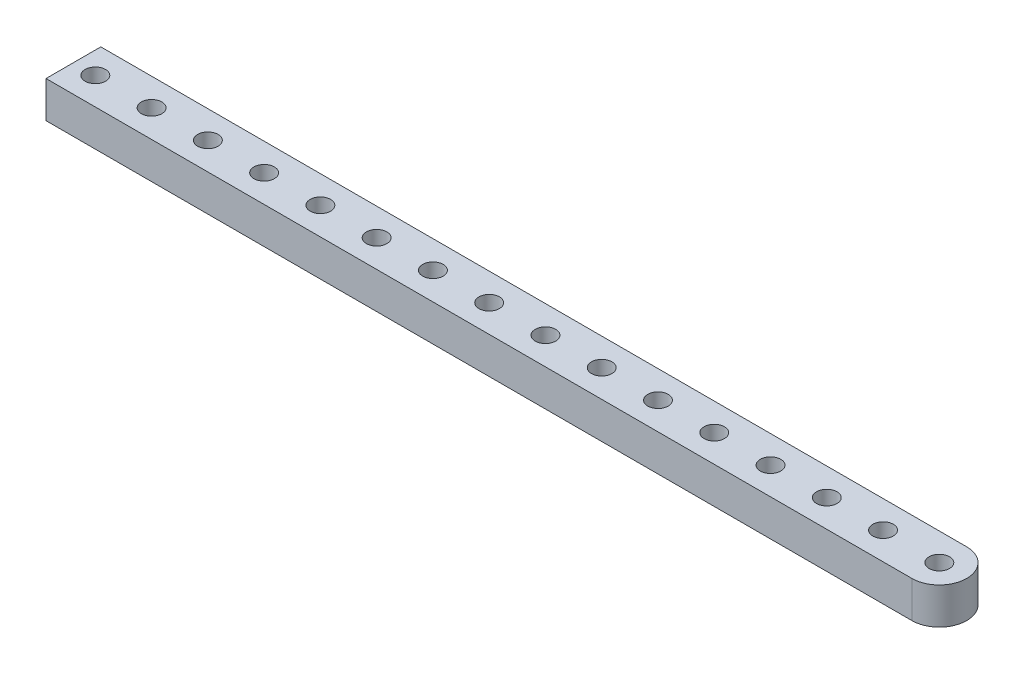
ISO-10303-21;
HEADER;
FILE_DESCRIPTION(('STEP AP214'),'2;1');
FILE_NAME('part.step','',(''),(''),'','','');
FILE_SCHEMA(('AUTOMOTIVE_DESIGN { 1 0 10303 214 1 1 1 1 }'));
ENDSEC;
DATA;
#1=APPLICATION_CONTEXT('core data for automotive mechanical design processes');
#2=APPLICATION_PROTOCOL_DEFINITION('international standard','automotive_design',2000,#1);
#3=PRODUCT_CONTEXT('',#1,'mechanical');
#4=PRODUCT('Part','Part','',(#3));
#5=PRODUCT_RELATED_PRODUCT_CATEGORY('part','',(#4));
#6=PRODUCT_DEFINITION_FORMATION('','',#4);
#7=PRODUCT_DEFINITION_CONTEXT('part definition',#1,'design');
#8=PRODUCT_DEFINITION('design','',#6,#7);
#9=PRODUCT_DEFINITION_SHAPE('','',#8);
#10=(LENGTH_UNIT() NAMED_UNIT(*) SI_UNIT(.MILLI.,.METRE.));
#11=(NAMED_UNIT(*) PLANE_ANGLE_UNIT() SI_UNIT($,.RADIAN.));
#12=(NAMED_UNIT(*) SI_UNIT($,.STERADIAN.) SOLID_ANGLE_UNIT());
#13=UNCERTAINTY_MEASURE_WITH_UNIT(LENGTH_MEASURE(1.E-05),#10,'distance_accuracy_value','');
#14=(GEOMETRIC_REPRESENTATION_CONTEXT(3) GLOBAL_UNCERTAINTY_ASSIGNED_CONTEXT((#13)) GLOBAL_UNIT_ASSIGNED_CONTEXT((#10,
#11,#12)) REPRESENTATION_CONTEXT('',''));
#15=CARTESIAN_POINT('',(0.,0.,0.));
#16=DIRECTION('',(0.,0.,1.));
#17=DIRECTION('',(1.,0.,0.));
#18=AXIS2_PLACEMENT_3D('',#15,#16,#17);
#19=CARTESIAN_POINT('',(78.232,0.,0.));
#20=DIRECTION('',(0.,1.,0.));
#21=DIRECTION('',(0.,0.,1.));
#22=AXIS2_PLACEMENT_3D('',#19,#20,#21);
#23=CYLINDRICAL_SURFACE('',#22,4.76250000000002);
#24=CARTESIAN_POINT('',(78.232,6.35,0.));
#25=DIRECTION('',(0.,1.,0.));
#26=DIRECTION('',(0.,0.,1.));
#27=AXIS2_PLACEMENT_3D('',#24,#25,#26);
#28=CIRCLE('',#27,4.76250000000002);
#29=CARTESIAN_POINT('',(78.232,6.35,4.76250000000002));
#30=VERTEX_POINT('',#29);
#31=CARTESIAN_POINT('',(78.232,6.35,-4.76250000000002));
#32=VERTEX_POINT('',#31);
#33=EDGE_CURVE('E76',#30,#32,#28,.T.);
#34=ORIENTED_EDGE('',*,*,#33,.F.);
#35=DIRECTION('',(0.,1.,0.));
#36=VECTOR('',#35,1.);
#37=CARTESIAN_POINT('',(78.232,0.,4.76250000000002));
#38=LINE('',#37,#36);
#39=CARTESIAN_POINT('',(78.232,0.,4.76250000000002));
#40=VERTEX_POINT('',#39);
#41=EDGE_CURVE('E11',#40,#30,#38,.T.);
#42=ORIENTED_EDGE('',*,*,#41,.F.);
#43=CARTESIAN_POINT('',(78.232,0.,0.));
#44=DIRECTION('',(0.,1.,0.));
#45=DIRECTION('',(0.,0.,1.));
#46=AXIS2_PLACEMENT_3D('',#43,#44,#45);
#47=CIRCLE('',#46,4.76250000000002);
#48=CARTESIAN_POINT('',(78.232,0.,-4.76250000000002));
#49=VERTEX_POINT('',#48);
#50=EDGE_CURVE('E78',#40,#49,#47,.T.);
#51=ORIENTED_EDGE('',*,*,#50,.T.);
#52=DIRECTION('',(0.,1.,0.));
#53=VECTOR('',#52,1.);
#54=CARTESIAN_POINT('',(78.232,0.,-4.76250000000002));
#55=LINE('',#54,#53);
#56=EDGE_CURVE('E39',#49,#32,#55,.T.);
#57=ORIENTED_EDGE('',*,*,#56,.T.);
#58=EDGE_LOOP('',(#34,#42,#51,#57));
#59=FACE_BOUND('',#58,.T.);
#60=ADVANCED_FACE('F36',(#59),#23,.T.);
#61=CARTESIAN_POINT('',(-78.232,0.,4.76250000000002));
#62=DIRECTION('',(0.,0.,1.));
#63=DIRECTION('',(1.,0.,0.));
#64=AXIS2_PLACEMENT_3D('',#61,#62,#63);
#65=PLANE('',#64);
#66=DIRECTION('',(0.,1.,0.));
#67=VECTOR('',#66,1.);
#68=CARTESIAN_POINT('',(-72.263,0.,4.76250000000002));
#69=LINE('',#68,#67);
#70=CARTESIAN_POINT('',(-72.263,0.,4.76250000000002));
#71=VERTEX_POINT('',#70);
#72=CARTESIAN_POINT('',(-72.263,6.35,4.76250000000002));
#73=VERTEX_POINT('',#72);
#74=EDGE_CURVE('E50',#71,#73,#69,.T.);
#75=ORIENTED_EDGE('',*,*,#74,.F.);
#76=DIRECTION('',(1.,0.,0.));
#77=VECTOR('',#76,1.);
#78=CARTESIAN_POINT('',(-78.232,0.,4.76250000000002));
#79=LINE('',#78,#77);
#80=EDGE_CURVE('E57',#71,#40,#79,.T.);
#81=ORIENTED_EDGE('',*,*,#80,.T.);
#82=ORIENTED_EDGE('',*,*,#41,.T.);
#83=DIRECTION('',(1.,0.,0.));
#84=VECTOR('',#83,1.);
#85=CARTESIAN_POINT('',(-78.232,6.35,4.76250000000002));
#86=LINE('',#85,#84);
#87=EDGE_CURVE('E71',#73,#30,#86,.T.);
#88=ORIENTED_EDGE('',*,*,#87,.F.);
#89=EDGE_LOOP('',(#75,#81,#82,#88));
#90=FACE_BOUND('',#89,.T.);
#91=ADVANCED_FACE('F81',(#90),#65,.T.);
#92=CARTESIAN_POINT('',(78.232,0.,-4.76250000000002));
#93=DIRECTION('',(0.,0.,-1.));
#94=DIRECTION('',(-1.,0.,0.));
#95=AXIS2_PLACEMENT_3D('',#92,#93,#94);
#96=PLANE('',#95);
#97=DIRECTION('',(0.,-1.,0.));
#98=VECTOR('',#97,1.);
#99=CARTESIAN_POINT('',(-72.263,0.,-4.76250000000001));
#100=LINE('',#99,#98);
#101=CARTESIAN_POINT('',(-72.263,6.35,-4.76250000000002));
#102=VERTEX_POINT('',#101);
#103=CARTESIAN_POINT('',(-72.263,0.,-4.76250000000002));
#104=VERTEX_POINT('',#103);
#105=EDGE_CURVE('E188',#102,#104,#100,.T.);
#106=ORIENTED_EDGE('',*,*,#105,.F.);
#107=DIRECTION('',(-1.,0.,0.));
#108=VECTOR('',#107,1.);
#109=CARTESIAN_POINT('',(78.232,6.35,-4.76250000000002));
#110=LINE('',#109,#108);
#111=EDGE_CURVE('E79',#32,#102,#110,.T.);
#112=ORIENTED_EDGE('',*,*,#111,.F.);
#113=ORIENTED_EDGE('',*,*,#56,.F.);
#114=DIRECTION('',(-1.,0.,0.));
#115=VECTOR('',#114,1.);
#116=CARTESIAN_POINT('',(78.232,0.,-4.76250000000002));
#117=LINE('',#116,#115);
#118=EDGE_CURVE('E94',#49,#104,#117,.T.);
#119=ORIENTED_EDGE('',*,*,#118,.T.);
#120=EDGE_LOOP('',(#106,#112,#113,#119));
#121=FACE_BOUND('',#120,.T.);
#122=ADVANCED_FACE('F204',(#121),#96,.T.);
#123=CARTESIAN_POINT('',(78.232,0.,0.));
#124=DIRECTION('',(0.,1.,0.));
#125=DIRECTION('',(0.,0.,1.));
#126=AXIS2_PLACEMENT_3D('',#123,#124,#125);
#127=PLANE('',#126);
#128=CARTESIAN_POINT('',(-68.453,0.,0.));
#129=DIRECTION('',(0.,1.,0.));
#130=DIRECTION('',(0.,0.,-1.));
#131=AXIS2_PLACEMENT_3D('',#128,#129,#130);
#132=CIRCLE('',#131,1.77799999999999);
#133=CARTESIAN_POINT('',(-68.453,0.,-1.77799999999999));
#134=VERTEX_POINT('',#133);
#135=EDGE_CURVE('E182',#134,#134,#132,.T.);
#136=ORIENTED_EDGE('',*,*,#135,.T.);
#137=EDGE_LOOP('',(#136));
#138=FACE_BOUND('',#137,.T.);
#139=CARTESIAN_POINT('',(-58.674,0.,0.));
#140=DIRECTION('',(0.,1.,0.));
#141=DIRECTION('',(0.,0.,-1.));
#142=AXIS2_PLACEMENT_3D('',#139,#140,#141);
#143=CIRCLE('',#142,1.77799999999999);
#144=CARTESIAN_POINT('',(-58.674,0.,-1.77799999999999));
#145=VERTEX_POINT('',#144);
#146=EDGE_CURVE('E176',#145,#145,#143,.T.);
#147=ORIENTED_EDGE('',*,*,#146,.T.);
#148=EDGE_LOOP('',(#147));
#149=FACE_BOUND('',#148,.T.);
#150=CARTESIAN_POINT('',(-48.895,0.,0.));
#151=DIRECTION('',(0.,1.,0.));
#152=DIRECTION('',(0.,0.,-1.));
#153=AXIS2_PLACEMENT_3D('',#150,#151,#152);
#154=CIRCLE('',#153,1.77799999999999);
#155=CARTESIAN_POINT('',(-48.895,0.,-1.77799999999999));
#156=VERTEX_POINT('',#155);
#157=EDGE_CURVE('E170',#156,#156,#154,.T.);
#158=ORIENTED_EDGE('',*,*,#157,.T.);
#159=EDGE_LOOP('',(#158));
#160=FACE_BOUND('',#159,.T.);
#161=CARTESIAN_POINT('',(-39.116,0.,0.));
#162=DIRECTION('',(0.,1.,0.));
#163=DIRECTION('',(0.,0.,-1.));
#164=AXIS2_PLACEMENT_3D('',#161,#162,#163);
#165=CIRCLE('',#164,1.77799999999999);
#166=CARTESIAN_POINT('',(-39.116,0.,-1.77799999999999));
#167=VERTEX_POINT('',#166);
#168=EDGE_CURVE('E164',#167,#167,#165,.T.);
#169=ORIENTED_EDGE('',*,*,#168,.T.);
#170=EDGE_LOOP('',(#169));
#171=FACE_BOUND('',#170,.T.);
#172=CARTESIAN_POINT('',(-29.337,0.,0.));
#173=DIRECTION('',(0.,1.,0.));
#174=DIRECTION('',(0.,0.,-1.));
#175=AXIS2_PLACEMENT_3D('',#172,#173,#174);
#176=CIRCLE('',#175,1.77799999999999);
#177=CARTESIAN_POINT('',(-29.337,0.,-1.77799999999998));
#178=VERTEX_POINT('',#177);
#179=EDGE_CURVE('E158',#178,#178,#176,.T.);
#180=ORIENTED_EDGE('',*,*,#179,.T.);
#181=EDGE_LOOP('',(#180));
#182=FACE_BOUND('',#181,.T.);
#183=CARTESIAN_POINT('',(-19.558,0.,0.));
#184=DIRECTION('',(0.,1.,0.));
#185=DIRECTION('',(0.,0.,-1.));
#186=AXIS2_PLACEMENT_3D('',#183,#184,#185);
#187=CIRCLE('',#186,1.77799999999999);
#188=CARTESIAN_POINT('',(-19.558,0.,-1.77799999999998));
#189=VERTEX_POINT('',#188);
#190=EDGE_CURVE('E152',#189,#189,#187,.T.);
#191=ORIENTED_EDGE('',*,*,#190,.T.);
#192=EDGE_LOOP('',(#191));
#193=FACE_BOUND('',#192,.T.);
#194=CARTESIAN_POINT('',(-9.77900000000001,0.,0.));
#195=DIRECTION('',(0.,1.,0.));
#196=DIRECTION('',(0.,0.,-1.));
#197=AXIS2_PLACEMENT_3D('',#194,#195,#196);
#198=CIRCLE('',#197,1.77799999999999);
#199=CARTESIAN_POINT('',(-9.77900000000001,0.,-1.77799999999998));
#200=VERTEX_POINT('',#199);
#201=EDGE_CURVE('E146',#200,#200,#198,.T.);
#202=ORIENTED_EDGE('',*,*,#201,.T.);
#203=EDGE_LOOP('',(#202));
#204=FACE_BOUND('',#203,.T.);
#205=CARTESIAN_POINT('',(0.,0.,0.));
#206=DIRECTION('',(0.,1.,0.));
#207=DIRECTION('',(0.,0.,-1.));
#208=AXIS2_PLACEMENT_3D('',#205,#206,#207);
#209=CIRCLE('',#208,1.77799999999999);
#210=CARTESIAN_POINT('',(0.,0.,-1.77799999999998));
#211=VERTEX_POINT('',#210);
#212=EDGE_CURVE('E140',#211,#211,#209,.T.);
#213=ORIENTED_EDGE('',*,*,#212,.T.);
#214=EDGE_LOOP('',(#213));
#215=FACE_BOUND('',#214,.T.);
#216=CARTESIAN_POINT('',(9.77899999999998,0.,0.));
#217=DIRECTION('',(0.,1.,0.));
#218=DIRECTION('',(0.,0.,-1.));
#219=AXIS2_PLACEMENT_3D('',#216,#217,#218);
#220=CIRCLE('',#219,1.77799999999999);
#221=CARTESIAN_POINT('',(9.77899999999998,0.,-1.77799999999998));
#222=VERTEX_POINT('',#221);
#223=EDGE_CURVE('E134',#222,#222,#220,.T.);
#224=ORIENTED_EDGE('',*,*,#223,.T.);
#225=EDGE_LOOP('',(#224));
#226=FACE_BOUND('',#225,.T.);
#227=CARTESIAN_POINT('',(19.558,0.,0.));
#228=DIRECTION('',(0.,1.,0.));
#229=DIRECTION('',(0.,0.,-1.));
#230=AXIS2_PLACEMENT_3D('',#227,#228,#229);
#231=CIRCLE('',#230,1.77799999999999);
#232=CARTESIAN_POINT('',(19.558,0.,-1.77799999999998));
#233=VERTEX_POINT('',#232);
#234=EDGE_CURVE('E128',#233,#233,#231,.T.);
#235=ORIENTED_EDGE('',*,*,#234,.T.);
#236=EDGE_LOOP('',(#235));
#237=FACE_BOUND('',#236,.T.);
#238=CARTESIAN_POINT('',(29.337,0.,0.));
#239=DIRECTION('',(0.,1.,0.));
#240=DIRECTION('',(0.,0.,-1.));
#241=AXIS2_PLACEMENT_3D('',#238,#239,#240);
#242=CIRCLE('',#241,1.77799999999999);
#243=CARTESIAN_POINT('',(29.337,0.,-1.77799999999998));
#244=VERTEX_POINT('',#243);
#245=EDGE_CURVE('E122',#244,#244,#242,.T.);
#246=ORIENTED_EDGE('',*,*,#245,.T.);
#247=EDGE_LOOP('',(#246));
#248=FACE_BOUND('',#247,.T.);
#249=CARTESIAN_POINT('',(39.116,0.,0.));
#250=DIRECTION('',(0.,1.,0.));
#251=DIRECTION('',(0.,0.,-1.));
#252=AXIS2_PLACEMENT_3D('',#249,#250,#251);
#253=CIRCLE('',#252,1.77799999999999);
#254=CARTESIAN_POINT('',(39.116,0.,-1.77799999999998));
#255=VERTEX_POINT('',#254);
#256=EDGE_CURVE('E116',#255,#255,#253,.T.);
#257=ORIENTED_EDGE('',*,*,#256,.T.);
#258=EDGE_LOOP('',(#257));
#259=FACE_BOUND('',#258,.T.);
#260=CARTESIAN_POINT('',(48.895,0.,0.));
#261=DIRECTION('',(0.,1.,0.));
#262=DIRECTION('',(0.,0.,-1.));
#263=AXIS2_PLACEMENT_3D('',#260,#261,#262);
#264=CIRCLE('',#263,1.77799999999999);
#265=CARTESIAN_POINT('',(48.895,0.,-1.77799999999998));
#266=VERTEX_POINT('',#265);
#267=EDGE_CURVE('E110',#266,#266,#264,.T.);
#268=ORIENTED_EDGE('',*,*,#267,.T.);
#269=EDGE_LOOP('',(#268));
#270=FACE_BOUND('',#269,.T.);
#271=CARTESIAN_POINT('',(58.674,0.,0.));
#272=DIRECTION('',(0.,1.,0.));
#273=DIRECTION('',(0.,0.,-1.));
#274=AXIS2_PLACEMENT_3D('',#271,#272,#273);
#275=CIRCLE('',#274,1.77799999999999);
#276=CARTESIAN_POINT('',(58.674,0.,-1.77799999999998));
#277=VERTEX_POINT('',#276);
#278=EDGE_CURVE('E104',#277,#277,#275,.T.);
#279=ORIENTED_EDGE('',*,*,#278,.T.);
#280=EDGE_LOOP('',(#279));
#281=FACE_BOUND('',#280,.T.);
#282=CARTESIAN_POINT('',(68.453,0.,0.));
#283=DIRECTION('',(0.,1.,0.));
#284=DIRECTION('',(0.,0.,-1.));
#285=AXIS2_PLACEMENT_3D('',#282,#283,#284);
#286=CIRCLE('',#285,1.77799999999999);
#287=CARTESIAN_POINT('',(68.453,0.,-1.77799999999997));
#288=VERTEX_POINT('',#287);
#289=EDGE_CURVE('E99',#288,#288,#286,.T.);
#290=ORIENTED_EDGE('',*,*,#289,.T.);
#291=EDGE_LOOP('',(#290));
#292=FACE_BOUND('',#291,.T.);
#293=CARTESIAN_POINT('',(78.232,0.,0.));
#294=DIRECTION('',(0.,1.,0.));
#295=DIRECTION('',(0.,0.,-1.));
#296=AXIS2_PLACEMENT_3D('',#293,#294,#295);
#297=CIRCLE('',#296,1.77799999999999);
#298=CARTESIAN_POINT('',(78.232,0.,-1.77799999999997));
#299=VERTEX_POINT('',#298);
#300=EDGE_CURVE('E86',#299,#299,#297,.T.);
#301=ORIENTED_EDGE('',*,*,#300,.T.);
#302=EDGE_LOOP('',(#301));
#303=FACE_BOUND('',#302,.T.);
#304=ORIENTED_EDGE('',*,*,#80,.F.);
#305=DIRECTION('',(0.,0.,-1.));
#306=VECTOR('',#305,1.);
#307=CARTESIAN_POINT('',(-72.263,0.,-5.07999999999998));
#308=LINE('',#307,#306);
#309=EDGE_CURVE('E194',#71,#104,#308,.T.);
#310=ORIENTED_EDGE('',*,*,#309,.T.);
#311=ORIENTED_EDGE('',*,*,#118,.F.);
#312=ORIENTED_EDGE('',*,*,#50,.F.);
#313=EDGE_LOOP('',(#304,#310,#311,#312));
#314=FACE_BOUND('',#313,.T.);
#315=ADVANCED_FACE('F199',(#138,#149,#160,#171,#182,#193,#204,#215,#226,#237,#248,#259,#270,
#281,#292,#303,#314),#127,.F.);
#316=CARTESIAN_POINT('',(78.232,6.35,0.));
#317=DIRECTION('',(0.,1.,0.));
#318=DIRECTION('',(0.,0.,1.));
#319=AXIS2_PLACEMENT_3D('',#316,#317,#318);
#320=PLANE('',#319);
#321=DIRECTION('',(0.,0.,-1.));
#322=VECTOR('',#321,1.);
#323=CARTESIAN_POINT('',(-72.263,6.35,-5.07999999999998));
#324=LINE('',#323,#322);
#325=EDGE_CURVE('E77',#73,#102,#324,.T.);
#326=ORIENTED_EDGE('',*,*,#325,.F.);
#327=ORIENTED_EDGE('',*,*,#87,.T.);
#328=ORIENTED_EDGE('',*,*,#33,.T.);
#329=ORIENTED_EDGE('',*,*,#111,.T.);
#330=EDGE_LOOP('',(#326,#327,#328,#329));
#331=FACE_BOUND('',#330,.T.);
#332=CARTESIAN_POINT('',(-68.453,6.35,0.));
#333=DIRECTION('',(0.,1.,0.));
#334=DIRECTION('',(0.,0.,-1.));
#335=AXIS2_PLACEMENT_3D('',#332,#333,#334);
#336=CIRCLE('',#335,1.77799999999999);
#337=CARTESIAN_POINT('',(-68.453,6.35,-1.77799999999999));
#338=VERTEX_POINT('',#337);
#339=EDGE_CURVE('E185',#338,#338,#336,.T.);
#340=ORIENTED_EDGE('',*,*,#339,.F.);
#341=EDGE_LOOP('',(#340));
#342=FACE_BOUND('',#341,.T.);
#343=CARTESIAN_POINT('',(-58.674,6.35,0.));
#344=DIRECTION('',(0.,1.,0.));
#345=DIRECTION('',(0.,0.,-1.));
#346=AXIS2_PLACEMENT_3D('',#343,#344,#345);
#347=CIRCLE('',#346,1.77799999999999);
#348=CARTESIAN_POINT('',(-58.674,6.35,-1.77799999999999));
#349=VERTEX_POINT('',#348);
#350=EDGE_CURVE('E179',#349,#349,#347,.T.);
#351=ORIENTED_EDGE('',*,*,#350,.F.);
#352=EDGE_LOOP('',(#351));
#353=FACE_BOUND('',#352,.T.);
#354=CARTESIAN_POINT('',(-48.895,6.35,0.));
#355=DIRECTION('',(0.,1.,0.));
#356=DIRECTION('',(0.,0.,-1.));
#357=AXIS2_PLACEMENT_3D('',#354,#355,#356);
#358=CIRCLE('',#357,1.77799999999999);
#359=CARTESIAN_POINT('',(-48.895,6.35,-1.77799999999999));
#360=VERTEX_POINT('',#359);
#361=EDGE_CURVE('E173',#360,#360,#358,.T.);
#362=ORIENTED_EDGE('',*,*,#361,.F.);
#363=EDGE_LOOP('',(#362));
#364=FACE_BOUND('',#363,.T.);
#365=CARTESIAN_POINT('',(-39.116,6.35,0.));
#366=DIRECTION('',(0.,1.,0.));
#367=DIRECTION('',(0.,0.,-1.));
#368=AXIS2_PLACEMENT_3D('',#365,#366,#367);
#369=CIRCLE('',#368,1.77799999999999);
#370=CARTESIAN_POINT('',(-39.116,6.35,-1.77799999999999));
#371=VERTEX_POINT('',#370);
#372=EDGE_CURVE('E167',#371,#371,#369,.T.);
#373=ORIENTED_EDGE('',*,*,#372,.F.);
#374=EDGE_LOOP('',(#373));
#375=FACE_BOUND('',#374,.T.);
#376=CARTESIAN_POINT('',(-29.337,6.35,0.));
#377=DIRECTION('',(0.,1.,0.));
#378=DIRECTION('',(0.,0.,-1.));
#379=AXIS2_PLACEMENT_3D('',#376,#377,#378);
#380=CIRCLE('',#379,1.77799999999999);
#381=CARTESIAN_POINT('',(-29.337,6.35,-1.77799999999998));
#382=VERTEX_POINT('',#381);
#383=EDGE_CURVE('E161',#382,#382,#380,.T.);
#384=ORIENTED_EDGE('',*,*,#383,.F.);
#385=EDGE_LOOP('',(#384));
#386=FACE_BOUND('',#385,.T.);
#387=CARTESIAN_POINT('',(-19.558,6.35,0.));
#388=DIRECTION('',(0.,1.,0.));
#389=DIRECTION('',(0.,0.,-1.));
#390=AXIS2_PLACEMENT_3D('',#387,#388,#389);
#391=CIRCLE('',#390,1.77799999999999);
#392=CARTESIAN_POINT('',(-19.558,6.35,-1.77799999999998));
#393=VERTEX_POINT('',#392);
#394=EDGE_CURVE('E155',#393,#393,#391,.T.);
#395=ORIENTED_EDGE('',*,*,#394,.F.);
#396=EDGE_LOOP('',(#395));
#397=FACE_BOUND('',#396,.T.);
#398=CARTESIAN_POINT('',(-9.77900000000001,6.35,0.));
#399=DIRECTION('',(0.,1.,0.));
#400=DIRECTION('',(0.,0.,-1.));
#401=AXIS2_PLACEMENT_3D('',#398,#399,#400);
#402=CIRCLE('',#401,1.77799999999999);
#403=CARTESIAN_POINT('',(-9.77900000000001,6.35,-1.77799999999998));
#404=VERTEX_POINT('',#403);
#405=EDGE_CURVE('E149',#404,#404,#402,.T.);
#406=ORIENTED_EDGE('',*,*,#405,.F.);
#407=EDGE_LOOP('',(#406));
#408=FACE_BOUND('',#407,.T.);
#409=CARTESIAN_POINT('',(0.,6.35,0.));
#410=DIRECTION('',(0.,1.,0.));
#411=DIRECTION('',(0.,0.,-1.));
#412=AXIS2_PLACEMENT_3D('',#409,#410,#411);
#413=CIRCLE('',#412,1.77799999999999);
#414=CARTESIAN_POINT('',(0.,6.35,-1.77799999999998));
#415=VERTEX_POINT('',#414);
#416=EDGE_CURVE('E143',#415,#415,#413,.T.);
#417=ORIENTED_EDGE('',*,*,#416,.F.);
#418=EDGE_LOOP('',(#417));
#419=FACE_BOUND('',#418,.T.);
#420=CARTESIAN_POINT('',(9.77899999999998,6.35,0.));
#421=DIRECTION('',(0.,1.,0.));
#422=DIRECTION('',(0.,0.,-1.));
#423=AXIS2_PLACEMENT_3D('',#420,#421,#422);
#424=CIRCLE('',#423,1.77799999999999);
#425=CARTESIAN_POINT('',(9.77899999999998,6.35,-1.77799999999998));
#426=VERTEX_POINT('',#425);
#427=EDGE_CURVE('E137',#426,#426,#424,.T.);
#428=ORIENTED_EDGE('',*,*,#427,.F.);
#429=EDGE_LOOP('',(#428));
#430=FACE_BOUND('',#429,.T.);
#431=CARTESIAN_POINT('',(19.558,6.35,0.));
#432=DIRECTION('',(0.,1.,0.));
#433=DIRECTION('',(0.,0.,-1.));
#434=AXIS2_PLACEMENT_3D('',#431,#432,#433);
#435=CIRCLE('',#434,1.77799999999999);
#436=CARTESIAN_POINT('',(19.558,6.35,-1.77799999999998));
#437=VERTEX_POINT('',#436);
#438=EDGE_CURVE('E131',#437,#437,#435,.T.);
#439=ORIENTED_EDGE('',*,*,#438,.F.);
#440=EDGE_LOOP('',(#439));
#441=FACE_BOUND('',#440,.T.);
#442=CARTESIAN_POINT('',(29.337,6.35,0.));
#443=DIRECTION('',(0.,1.,0.));
#444=DIRECTION('',(0.,0.,-1.));
#445=AXIS2_PLACEMENT_3D('',#442,#443,#444);
#446=CIRCLE('',#445,1.77799999999999);
#447=CARTESIAN_POINT('',(29.337,6.35,-1.77799999999998));
#448=VERTEX_POINT('',#447);
#449=EDGE_CURVE('E125',#448,#448,#446,.T.);
#450=ORIENTED_EDGE('',*,*,#449,.F.);
#451=EDGE_LOOP('',(#450));
#452=FACE_BOUND('',#451,.T.);
#453=CARTESIAN_POINT('',(39.116,6.35,0.));
#454=DIRECTION('',(0.,1.,0.));
#455=DIRECTION('',(0.,0.,-1.));
#456=AXIS2_PLACEMENT_3D('',#453,#454,#455);
#457=CIRCLE('',#456,1.77799999999999);
#458=CARTESIAN_POINT('',(39.116,6.35,-1.77799999999998));
#459=VERTEX_POINT('',#458);
#460=EDGE_CURVE('E119',#459,#459,#457,.T.);
#461=ORIENTED_EDGE('',*,*,#460,.F.);
#462=EDGE_LOOP('',(#461));
#463=FACE_BOUND('',#462,.T.);
#464=CARTESIAN_POINT('',(48.895,6.35,0.));
#465=DIRECTION('',(0.,1.,0.));
#466=DIRECTION('',(0.,0.,-1.));
#467=AXIS2_PLACEMENT_3D('',#464,#465,#466);
#468=CIRCLE('',#467,1.77799999999999);
#469=CARTESIAN_POINT('',(48.895,6.35,-1.77799999999998));
#470=VERTEX_POINT('',#469);
#471=EDGE_CURVE('E113',#470,#470,#468,.T.);
#472=ORIENTED_EDGE('',*,*,#471,.F.);
#473=EDGE_LOOP('',(#472));
#474=FACE_BOUND('',#473,.T.);
#475=CARTESIAN_POINT('',(58.674,6.35,0.));
#476=DIRECTION('',(0.,1.,0.));
#477=DIRECTION('',(0.,0.,-1.));
#478=AXIS2_PLACEMENT_3D('',#475,#476,#477);
#479=CIRCLE('',#478,1.77799999999999);
#480=CARTESIAN_POINT('',(58.674,6.35,-1.77799999999998));
#481=VERTEX_POINT('',#480);
#482=EDGE_CURVE('E107',#481,#481,#479,.T.);
#483=ORIENTED_EDGE('',*,*,#482,.F.);
#484=EDGE_LOOP('',(#483));
#485=FACE_BOUND('',#484,.T.);
#486=CARTESIAN_POINT('',(68.453,6.35,0.));
#487=DIRECTION('',(0.,1.,0.));
#488=DIRECTION('',(0.,0.,-1.));
#489=AXIS2_PLACEMENT_3D('',#486,#487,#488);
#490=CIRCLE('',#489,1.77799999999999);
#491=CARTESIAN_POINT('',(68.453,6.35,-1.77799999999997));
#492=VERTEX_POINT('',#491);
#493=EDGE_CURVE('E101',#492,#492,#490,.T.);
#494=ORIENTED_EDGE('',*,*,#493,.F.);
#495=EDGE_LOOP('',(#494));
#496=FACE_BOUND('',#495,.T.);
#497=CARTESIAN_POINT('',(78.232,6.35,0.));
#498=DIRECTION('',(0.,1.,0.));
#499=DIRECTION('',(0.,0.,-1.));
#500=AXIS2_PLACEMENT_3D('',#497,#498,#499);
#501=CIRCLE('',#500,1.77799999999999);
#502=CARTESIAN_POINT('',(78.232,6.35,-1.77799999999997));
#503=VERTEX_POINT('',#502);
#504=EDGE_CURVE('E90',#503,#503,#501,.T.);
#505=ORIENTED_EDGE('',*,*,#504,.F.);
#506=EDGE_LOOP('',(#505));
#507=FACE_BOUND('',#506,.T.);
#508=ADVANCED_FACE('F72',(#331,#342,#353,#364,#375,#386,#397,#408,#419,#430,#441,#452,#463,#474,
#485,#496,#507),#320,.T.);
#509=CARTESIAN_POINT('',(78.232,0.,0.));
#510=DIRECTION('',(0.,1.,0.));
#511=DIRECTION('',(0.,0.,1.));
#512=AXIS2_PLACEMENT_3D('',#509,#510,#511);
#513=CYLINDRICAL_SURFACE('',#512,1.77799999999999);
#514=ORIENTED_EDGE('',*,*,#300,.F.);
#515=EDGE_LOOP('',(#514));
#516=FACE_BOUND('',#515,.T.);
#517=ORIENTED_EDGE('',*,*,#504,.T.);
#518=EDGE_LOOP('',(#517));
#519=FACE_BOUND('',#518,.T.);
#520=ADVANCED_FACE('F228',(#516,#519),#513,.F.);
#521=CARTESIAN_POINT('',(68.453,0.,0.));
#522=DIRECTION('',(0.,1.,0.));
#523=DIRECTION('',(0.,0.,1.));
#524=AXIS2_PLACEMENT_3D('',#521,#522,#523);
#525=CYLINDRICAL_SURFACE('',#524,1.77799999999999);
#526=ORIENTED_EDGE('',*,*,#289,.F.);
#527=EDGE_LOOP('',(#526));
#528=FACE_BOUND('',#527,.T.);
#529=ORIENTED_EDGE('',*,*,#493,.T.);
#530=EDGE_LOOP('',(#529));
#531=FACE_BOUND('',#530,.T.);
#532=ADVANCED_FACE('F234',(#528,#531),#525,.F.);
#533=CARTESIAN_POINT('',(58.674,0.,0.));
#534=DIRECTION('',(0.,1.,0.));
#535=DIRECTION('',(0.,0.,1.));
#536=AXIS2_PLACEMENT_3D('',#533,#534,#535);
#537=CYLINDRICAL_SURFACE('',#536,1.77799999999999);
#538=ORIENTED_EDGE('',*,*,#278,.F.);
#539=EDGE_LOOP('',(#538));
#540=FACE_BOUND('',#539,.T.);
#541=ORIENTED_EDGE('',*,*,#482,.T.);
#542=EDGE_LOOP('',(#541));
#543=FACE_BOUND('',#542,.T.);
#544=ADVANCED_FACE('F238',(#540,#543),#537,.F.);
#545=CARTESIAN_POINT('',(48.895,0.,0.));
#546=DIRECTION('',(0.,1.,0.));
#547=DIRECTION('',(0.,0.,1.));
#548=AXIS2_PLACEMENT_3D('',#545,#546,#547);
#549=CYLINDRICAL_SURFACE('',#548,1.77799999999999);
#550=ORIENTED_EDGE('',*,*,#267,.F.);
#551=EDGE_LOOP('',(#550));
#552=FACE_BOUND('',#551,.T.);
#553=ORIENTED_EDGE('',*,*,#471,.T.);
#554=EDGE_LOOP('',(#553));
#555=FACE_BOUND('',#554,.T.);
#556=ADVANCED_FACE('F242',(#552,#555),#549,.F.);
#557=CARTESIAN_POINT('',(39.116,0.,0.));
#558=DIRECTION('',(0.,1.,0.));
#559=DIRECTION('',(0.,0.,1.));
#560=AXIS2_PLACEMENT_3D('',#557,#558,#559);
#561=CYLINDRICAL_SURFACE('',#560,1.77799999999999);
#562=ORIENTED_EDGE('',*,*,#256,.F.);
#563=EDGE_LOOP('',(#562));
#564=FACE_BOUND('',#563,.T.);
#565=ORIENTED_EDGE('',*,*,#460,.T.);
#566=EDGE_LOOP('',(#565));
#567=FACE_BOUND('',#566,.T.);
#568=ADVANCED_FACE('F246',(#564,#567),#561,.F.);
#569=CARTESIAN_POINT('',(29.337,0.,0.));
#570=DIRECTION('',(0.,1.,0.));
#571=DIRECTION('',(0.,0.,1.));
#572=AXIS2_PLACEMENT_3D('',#569,#570,#571);
#573=CYLINDRICAL_SURFACE('',#572,1.77799999999999);
#574=ORIENTED_EDGE('',*,*,#245,.F.);
#575=EDGE_LOOP('',(#574));
#576=FACE_BOUND('',#575,.T.);
#577=ORIENTED_EDGE('',*,*,#449,.T.);
#578=EDGE_LOOP('',(#577));
#579=FACE_BOUND('',#578,.T.);
#580=ADVANCED_FACE('F250',(#576,#579),#573,.F.);
#581=CARTESIAN_POINT('',(19.558,0.,0.));
#582=DIRECTION('',(0.,1.,0.));
#583=DIRECTION('',(0.,0.,1.));
#584=AXIS2_PLACEMENT_3D('',#581,#582,#583);
#585=CYLINDRICAL_SURFACE('',#584,1.77799999999999);
#586=ORIENTED_EDGE('',*,*,#234,.F.);
#587=EDGE_LOOP('',(#586));
#588=FACE_BOUND('',#587,.T.);
#589=ORIENTED_EDGE('',*,*,#438,.T.);
#590=EDGE_LOOP('',(#589));
#591=FACE_BOUND('',#590,.T.);
#592=ADVANCED_FACE('F254',(#588,#591),#585,.F.);
#593=CARTESIAN_POINT('',(9.77899999999998,0.,0.));
#594=DIRECTION('',(0.,1.,0.));
#595=DIRECTION('',(0.,0.,1.));
#596=AXIS2_PLACEMENT_3D('',#593,#594,#595);
#597=CYLINDRICAL_SURFACE('',#596,1.77799999999999);
#598=ORIENTED_EDGE('',*,*,#223,.F.);
#599=EDGE_LOOP('',(#598));
#600=FACE_BOUND('',#599,.T.);
#601=ORIENTED_EDGE('',*,*,#427,.T.);
#602=EDGE_LOOP('',(#601));
#603=FACE_BOUND('',#602,.T.);
#604=ADVANCED_FACE('F258',(#600,#603),#597,.F.);
#605=CARTESIAN_POINT('',(0.,0.,0.));
#606=DIRECTION('',(0.,1.,0.));
#607=DIRECTION('',(0.,0.,1.));
#608=AXIS2_PLACEMENT_3D('',#605,#606,#607);
#609=CYLINDRICAL_SURFACE('',#608,1.77799999999999);
#610=ORIENTED_EDGE('',*,*,#212,.F.);
#611=EDGE_LOOP('',(#610));
#612=FACE_BOUND('',#611,.T.);
#613=ORIENTED_EDGE('',*,*,#416,.T.);
#614=EDGE_LOOP('',(#613));
#615=FACE_BOUND('',#614,.T.);
#616=ADVANCED_FACE('F262',(#612,#615),#609,.F.);
#617=CARTESIAN_POINT('',(-9.77900000000001,0.,0.));
#618=DIRECTION('',(0.,1.,0.));
#619=DIRECTION('',(0.,0.,1.));
#620=AXIS2_PLACEMENT_3D('',#617,#618,#619);
#621=CYLINDRICAL_SURFACE('',#620,1.77799999999999);
#622=ORIENTED_EDGE('',*,*,#201,.F.);
#623=EDGE_LOOP('',(#622));
#624=FACE_BOUND('',#623,.T.);
#625=ORIENTED_EDGE('',*,*,#405,.T.);
#626=EDGE_LOOP('',(#625));
#627=FACE_BOUND('',#626,.T.);
#628=ADVANCED_FACE('F266',(#624,#627),#621,.F.);
#629=CARTESIAN_POINT('',(-19.558,0.,0.));
#630=DIRECTION('',(0.,1.,0.));
#631=DIRECTION('',(0.,0.,1.));
#632=AXIS2_PLACEMENT_3D('',#629,#630,#631);
#633=CYLINDRICAL_SURFACE('',#632,1.77799999999999);
#634=ORIENTED_EDGE('',*,*,#190,.F.);
#635=EDGE_LOOP('',(#634));
#636=FACE_BOUND('',#635,.T.);
#637=ORIENTED_EDGE('',*,*,#394,.T.);
#638=EDGE_LOOP('',(#637));
#639=FACE_BOUND('',#638,.T.);
#640=ADVANCED_FACE('F270',(#636,#639),#633,.F.);
#641=CARTESIAN_POINT('',(-29.337,0.,0.));
#642=DIRECTION('',(0.,1.,0.));
#643=DIRECTION('',(0.,0.,1.));
#644=AXIS2_PLACEMENT_3D('',#641,#642,#643);
#645=CYLINDRICAL_SURFACE('',#644,1.77799999999999);
#646=ORIENTED_EDGE('',*,*,#179,.F.);
#647=EDGE_LOOP('',(#646));
#648=FACE_BOUND('',#647,.T.);
#649=ORIENTED_EDGE('',*,*,#383,.T.);
#650=EDGE_LOOP('',(#649));
#651=FACE_BOUND('',#650,.T.);
#652=ADVANCED_FACE('F274',(#648,#651),#645,.F.);
#653=CARTESIAN_POINT('',(-39.116,0.,0.));
#654=DIRECTION('',(0.,1.,0.));
#655=DIRECTION('',(0.,0.,1.));
#656=AXIS2_PLACEMENT_3D('',#653,#654,#655);
#657=CYLINDRICAL_SURFACE('',#656,1.77799999999999);
#658=ORIENTED_EDGE('',*,*,#168,.F.);
#659=EDGE_LOOP('',(#658));
#660=FACE_BOUND('',#659,.T.);
#661=ORIENTED_EDGE('',*,*,#372,.T.);
#662=EDGE_LOOP('',(#661));
#663=FACE_BOUND('',#662,.T.);
#664=ADVANCED_FACE('F278',(#660,#663),#657,.F.);
#665=CARTESIAN_POINT('',(-48.895,0.,0.));
#666=DIRECTION('',(0.,1.,0.));
#667=DIRECTION('',(0.,0.,1.));
#668=AXIS2_PLACEMENT_3D('',#665,#666,#667);
#669=CYLINDRICAL_SURFACE('',#668,1.77799999999999);
#670=ORIENTED_EDGE('',*,*,#157,.F.);
#671=EDGE_LOOP('',(#670));
#672=FACE_BOUND('',#671,.T.);
#673=ORIENTED_EDGE('',*,*,#361,.T.);
#674=EDGE_LOOP('',(#673));
#675=FACE_BOUND('',#674,.T.);
#676=ADVANCED_FACE('F282',(#672,#675),#669,.F.);
#677=CARTESIAN_POINT('',(-58.674,0.,0.));
#678=DIRECTION('',(0.,1.,0.));
#679=DIRECTION('',(0.,0.,1.));
#680=AXIS2_PLACEMENT_3D('',#677,#678,#679);
#681=CYLINDRICAL_SURFACE('',#680,1.77799999999999);
#682=ORIENTED_EDGE('',*,*,#146,.F.);
#683=EDGE_LOOP('',(#682));
#684=FACE_BOUND('',#683,.T.);
#685=ORIENTED_EDGE('',*,*,#350,.T.);
#686=EDGE_LOOP('',(#685));
#687=FACE_BOUND('',#686,.T.);
#688=ADVANCED_FACE('F214',(#684,#687),#681,.F.);
#689=CARTESIAN_POINT('',(-68.453,0.,0.));
#690=DIRECTION('',(0.,1.,0.));
#691=DIRECTION('',(0.,0.,1.));
#692=AXIS2_PLACEMENT_3D('',#689,#690,#691);
#693=CYLINDRICAL_SURFACE('',#692,1.77799999999999);
#694=ORIENTED_EDGE('',*,*,#135,.F.);
#695=EDGE_LOOP('',(#694));
#696=FACE_BOUND('',#695,.T.);
#697=ORIENTED_EDGE('',*,*,#339,.T.);
#698=EDGE_LOOP('',(#697));
#699=FACE_BOUND('',#698,.T.);
#700=ADVANCED_FACE('F209',(#696,#699),#693,.F.);
#701=CARTESIAN_POINT('',(-72.263,0.,-5.07999999999998));
#702=DIRECTION('',(1.,0.,0.));
#703=DIRECTION('',(0.,0.,-1.));
#704=AXIS2_PLACEMENT_3D('',#701,#702,#703);
#705=PLANE('',#704);
#706=ORIENTED_EDGE('',*,*,#105,.T.);
#707=ORIENTED_EDGE('',*,*,#309,.F.);
#708=ORIENTED_EDGE('',*,*,#74,.T.);
#709=ORIENTED_EDGE('',*,*,#325,.T.);
#710=EDGE_LOOP('',(#706,#707,#708,#709));
#711=FACE_BOUND('',#710,.T.);
#712=ADVANCED_FACE('F207',(#711),#705,.F.);
#713=CLOSED_SHELL('',(#60,#91,#122,#315,#508,#520,#532,#544,#556,#568,#580,#592,#604,#616,#628,
#640,#652,#664,#676,#688,#700,#712));
#714=MANIFOLD_SOLID_BREP('B2',#713);
#715=ADVANCED_BREP_SHAPE_REPRESENTATION('',(#18,#714),#14);
#716=SHAPE_DEFINITION_REPRESENTATION(#9,#715);
ENDSEC;
END-ISO-10303-21;
